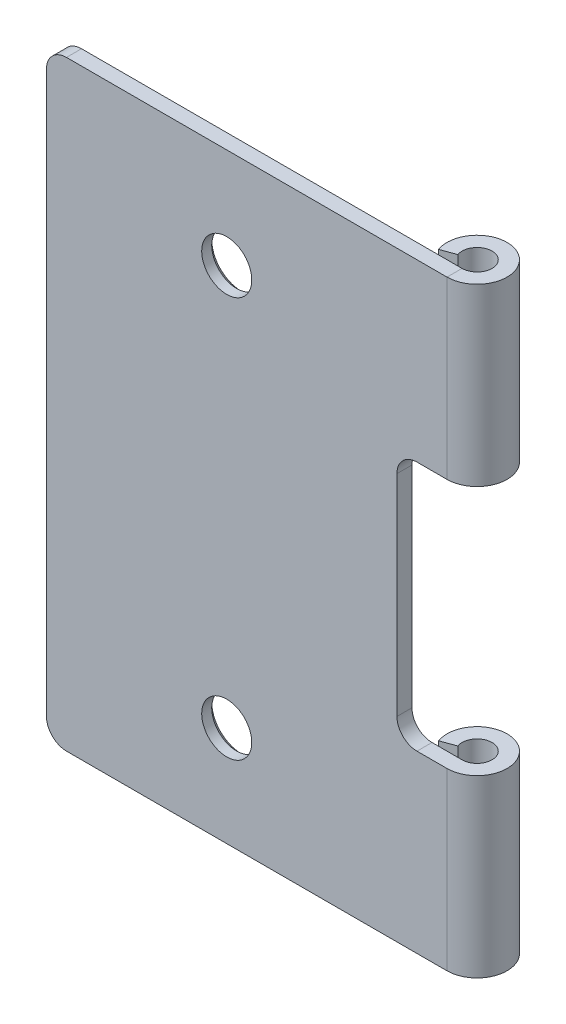
ISO-10303-21;
HEADER;
FILE_DESCRIPTION(('STEP AP214'),'2;1');
FILE_NAME('part.step','',(''),(''),'','','');
FILE_SCHEMA(('AUTOMOTIVE_DESIGN { 1 0 10303 214 1 1 1 1 }'));
ENDSEC;
DATA;
#1=APPLICATION_CONTEXT('core data for automotive mechanical design processes');
#2=APPLICATION_PROTOCOL_DEFINITION('international standard','automotive_design',2000,#1);
#3=PRODUCT_CONTEXT('',#1,'mechanical');
#4=PRODUCT('Part','Part','',(#3));
#5=PRODUCT_RELATED_PRODUCT_CATEGORY('part','',(#4));
#6=PRODUCT_DEFINITION_FORMATION('','',#4);
#7=PRODUCT_DEFINITION_CONTEXT('part definition',#1,'design');
#8=PRODUCT_DEFINITION('design','',#6,#7);
#9=PRODUCT_DEFINITION_SHAPE('','',#8);
#10=(LENGTH_UNIT() NAMED_UNIT(*) SI_UNIT(.MILLI.,.METRE.));
#11=(NAMED_UNIT(*) PLANE_ANGLE_UNIT() SI_UNIT($,.RADIAN.));
#12=(NAMED_UNIT(*) SI_UNIT($,.STERADIAN.) SOLID_ANGLE_UNIT());
#13=UNCERTAINTY_MEASURE_WITH_UNIT(LENGTH_MEASURE(1.E-05),#10,'distance_accuracy_value','');
#14=(GEOMETRIC_REPRESENTATION_CONTEXT(3) GLOBAL_UNCERTAINTY_ASSIGNED_CONTEXT((#13)) GLOBAL_UNIT_ASSIGNED_CONTEXT((#10,
#11,#12)) REPRESENTATION_CONTEXT('',''));
#15=CARTESIAN_POINT('',(0.,0.,0.));
#16=DIRECTION('',(0.,0.,1.));
#17=DIRECTION('',(1.,0.,0.));
#18=AXIS2_PLACEMENT_3D('',#15,#16,#17);
#19=CARTESIAN_POINT('',(10.3135852294402,1.25,0.15));
#20=DIRECTION('',(0.,1.,0.));
#21=DIRECTION('',(0.,0.,1.));
#22=AXIS2_PLACEMENT_3D('',#19,#20,#21);
#23=PLANE('',#22);
#24=DIRECTION('',(1.,0.,0.));
#25=VECTOR('',#24,1.);
#26=CARTESIAN_POINT('',(10.3135852294402,1.25,0.15));
#27=LINE('',#26,#25);
#28=CARTESIAN_POINT('',(9.71358522944015,1.25,0.15));
#29=VERTEX_POINT('',#28);
#30=CARTESIAN_POINT('',(10.0135852294402,1.25,0.15));
#31=VERTEX_POINT('',#30);
#32=EDGE_CURVE('E297',#29,#31,#27,.T.);
#33=ORIENTED_EDGE('',*,*,#32,.F.);
#34=DIRECTION('',(0.,0.,-1.));
#35=VECTOR('',#34,1.);
#36=CARTESIAN_POINT('',(9.71358522944015,1.25,0.));
#37=LINE('',#36,#35);
#38=CARTESIAN_POINT('',(9.71358522944015,1.25,0.));
#39=VERTEX_POINT('',#38);
#40=EDGE_CURVE('E242',#29,#39,#37,.T.);
#41=ORIENTED_EDGE('',*,*,#40,.T.);
#42=DIRECTION('',(1.,0.,0.));
#43=VECTOR('',#42,1.);
#44=CARTESIAN_POINT('',(10.0135852294402,1.25,0.));
#45=LINE('',#44,#43);
#46=CARTESIAN_POINT('',(10.0135852294402,1.25,0.));
#47=VERTEX_POINT('',#46);
#48=EDGE_CURVE('E282',#39,#47,#45,.T.);
#49=ORIENTED_EDGE('',*,*,#48,.T.);
#50=DIRECTION('',(0.,0.,1.));
#51=VECTOR('',#50,1.);
#52=CARTESIAN_POINT('',(10.0135852294402,1.25,0.));
#53=LINE('',#52,#51);
#54=EDGE_CURVE('E174',#47,#31,#53,.T.);
#55=ORIENTED_EDGE('',*,*,#54,.T.);
#56=EDGE_LOOP('',(#33,#41,#49,#55));
#57=FACE_BOUND('',#56,.T.);
#58=ADVANCED_FACE('F49',(#57),#23,.F.);
#59=CARTESIAN_POINT('',(10.0135852294402,3.,-0.15));
#60=DIRECTION('',(0.,-1.,0.));
#61=DIRECTION('',(0.,0.,-1.));
#62=AXIS2_PLACEMENT_3D('',#59,#60,#61);
#63=CYLINDRICAL_SURFACE('',#62,0.3);
#64=DIRECTION('',(0.,-1.,0.));
#65=VECTOR('',#64,1.);
#66=CARTESIAN_POINT('',(10.0135852294402,3.,0.15));
#67=LINE('',#66,#65);
#68=CARTESIAN_POINT('',(10.0135852294402,3.,0.15));
#69=VERTEX_POINT('',#68);
#70=EDGE_CURVE('E192',#69,#31,#67,.T.);
#71=ORIENTED_EDGE('',*,*,#70,.T.);
#72=CARTESIAN_POINT('',(10.0135852294402,1.25,-0.15));
#73=DIRECTION('',(0.,1.,0.));
#74=DIRECTION('',(0.,0.,1.));
#75=AXIS2_PLACEMENT_3D('',#72,#73,#74);
#76=CIRCLE('',#75,0.3);
#77=CARTESIAN_POINT('',(9.73167744320438,1.25,-0.0473939570023012));
#78=VERTEX_POINT('',#77);
#79=EDGE_CURVE('E325',#31,#78,#76,.T.);
#80=ORIENTED_EDGE('',*,*,#79,.T.);
#81=DIRECTION('',(0.,-1.,0.));
#82=VECTOR('',#81,1.);
#83=CARTESIAN_POINT('',(9.73167744320438,3.,-0.0473939570023011));
#84=LINE('',#83,#82);
#85=CARTESIAN_POINT('',(9.73167744320438,3.,-0.0473939570023011));
#86=VERTEX_POINT('',#85);
#87=EDGE_CURVE('E220',#86,#78,#84,.T.);
#88=ORIENTED_EDGE('',*,*,#87,.F.);
#89=CARTESIAN_POINT('',(10.0135852294402,3.,-0.15));
#90=DIRECTION('',(0.,1.,0.));
#91=DIRECTION('',(1.,0.,0.));
#92=AXIS2_PLACEMENT_3D('',#89,#90,#91);
#93=CIRCLE('',#92,0.3);
#94=EDGE_CURVE('E330',#69,#86,#93,.T.);
#95=ORIENTED_EDGE('',*,*,#94,.F.);
#96=EDGE_LOOP('',(#71,#80,#88,#95));
#97=FACE_BOUND('',#96,.T.);
#98=ADVANCED_FACE('F390',(#97),#63,.T.);
#99=CARTESIAN_POINT('',(9.87263133632226,3.,-0.0986969785011506));
#100=DIRECTION('',(0.342020143325664,0.,0.93969262078591));
#101=DIRECTION('',(0.93969262078591,0.,-0.342020143325664));
#102=AXIS2_PLACEMENT_3D('',#99,#100,#101);
#103=PLANE('',#102);
#104=DIRECTION('',(-0.93969262078591,0.,0.342020143325664));
#105=VECTOR('',#104,1.);
#106=CARTESIAN_POINT('',(9.87263133632226,1.25,-0.0986969785011506));
#107=LINE('',#106,#105);
#108=CARTESIAN_POINT('',(9.87263133632226,1.25,-0.0986969785011505));
#109=VERTEX_POINT('',#108);
#110=EDGE_CURVE('E322',#109,#78,#107,.T.);
#111=ORIENTED_EDGE('',*,*,#110,.F.);
#112=DIRECTION('',(0.,-1.,0.));
#113=VECTOR('',#112,1.);
#114=CARTESIAN_POINT('',(9.87263133632226,3.,-0.0986969785011506));
#115=LINE('',#114,#113);
#116=CARTESIAN_POINT('',(9.87263133632226,3.,-0.0986969785011506));
#117=VERTEX_POINT('',#116);
#118=EDGE_CURVE('E216',#117,#109,#115,.T.);
#119=ORIENTED_EDGE('',*,*,#118,.F.);
#120=DIRECTION('',(-0.93969262078591,0.,0.342020143325664));
#121=VECTOR('',#120,1.);
#122=CARTESIAN_POINT('',(9.87263133632226,3.,-0.0986969785011506));
#123=LINE('',#122,#121);
#124=EDGE_CURVE('E333',#117,#86,#123,.T.);
#125=ORIENTED_EDGE('',*,*,#124,.T.);
#126=ORIENTED_EDGE('',*,*,#87,.T.);
#127=EDGE_LOOP('',(#111,#119,#125,#126));
#128=FACE_BOUND('',#127,.T.);
#129=ADVANCED_FACE('F398',(#128),#103,.T.);
#130=CARTESIAN_POINT('',(10.0135852294402,3.,-0.15));
#131=DIRECTION('',(0.,-1.,0.));
#132=DIRECTION('',(0.,0.,-1.));
#133=AXIS2_PLACEMENT_3D('',#130,#131,#132);
#134=CYLINDRICAL_SURFACE('',#133,0.15);
#135=CARTESIAN_POINT('',(10.0135852294402,1.25,-0.15));
#136=DIRECTION('',(0.,1.,0.));
#137=DIRECTION('',(0.,0.,1.));
#138=AXIS2_PLACEMENT_3D('',#135,#136,#137);
#139=CIRCLE('',#138,0.15);
#140=EDGE_CURVE('E319',#47,#109,#139,.T.);
#141=ORIENTED_EDGE('',*,*,#140,.F.);
#142=DIRECTION('',(0.,-1.,0.));
#143=VECTOR('',#142,1.);
#144=CARTESIAN_POINT('',(10.0135852294402,3.,0.));
#145=LINE('',#144,#143);
#146=CARTESIAN_POINT('',(10.0135852294402,3.,0.));
#147=VERTEX_POINT('',#146);
#148=EDGE_CURVE('E211',#147,#47,#145,.T.);
#149=ORIENTED_EDGE('',*,*,#148,.F.);
#150=CARTESIAN_POINT('',(10.0135852294402,3.,-0.15));
#151=DIRECTION('',(0.,1.,0.));
#152=DIRECTION('',(0.,0.,1.));
#153=AXIS2_PLACEMENT_3D('',#150,#151,#152);
#154=CIRCLE('',#153,0.15);
#155=EDGE_CURVE('E337',#147,#117,#154,.T.);
#156=ORIENTED_EDGE('',*,*,#155,.T.);
#157=ORIENTED_EDGE('',*,*,#118,.T.);
#158=EDGE_LOOP('',(#141,#149,#156,#157));
#159=FACE_BOUND('',#158,.T.);
#160=ADVANCED_FACE('F415',(#159),#134,.F.);
#161=CARTESIAN_POINT('',(10.0135852294402,3.,0.15));
#162=DIRECTION('',(0.,1.,0.));
#163=DIRECTION('',(0.,0.,1.));
#164=AXIS2_PLACEMENT_3D('',#161,#162,#163);
#165=PLANE('',#164);
#166=DIRECTION('',(0.,0.,-1.));
#167=VECTOR('',#166,1.);
#168=CARTESIAN_POINT('',(10.0135852294402,3.,0.15));
#169=LINE('',#168,#167);
#170=EDGE_CURVE('E175',#69,#147,#169,.T.);
#171=ORIENTED_EDGE('',*,*,#170,.F.);
#172=ORIENTED_EDGE('',*,*,#94,.T.);
#173=ORIENTED_EDGE('',*,*,#124,.F.);
#174=ORIENTED_EDGE('',*,*,#155,.F.);
#175=EDGE_LOOP('',(#171,#172,#173,#174));
#176=FACE_BOUND('',#175,.T.);
#177=ADVANCED_FACE('F419',(#176),#165,.T.);
#178=CARTESIAN_POINT('',(10.0135852294402,-3.,0.));
#179=DIRECTION('',(0.,-1.,0.));
#180=DIRECTION('',(0.,0.,-1.));
#181=AXIS2_PLACEMENT_3D('',#178,#179,#180);
#182=PLANE('',#181);
#183=DIRECTION('',(0.,0.,1.));
#184=VECTOR('',#183,1.);
#185=CARTESIAN_POINT('',(10.0135852294402,-3.,0.));
#186=LINE('',#185,#184);
#187=CARTESIAN_POINT('',(10.0135852294402,-3.,0.));
#188=VERTEX_POINT('',#187);
#189=CARTESIAN_POINT('',(10.0135852294402,-3.,0.15));
#190=VERTEX_POINT('',#189);
#191=EDGE_CURVE('E224',#188,#190,#186,.T.);
#192=ORIENTED_EDGE('',*,*,#191,.F.);
#193=CARTESIAN_POINT('',(10.0135852294402,-3.,-0.15));
#194=DIRECTION('',(0.,1.,0.));
#195=DIRECTION('',(0.,0.,1.));
#196=AXIS2_PLACEMENT_3D('',#193,#194,#195);
#197=CIRCLE('',#196,0.15);
#198=CARTESIAN_POINT('',(9.87263133632226,-3.,-0.0986969785011506));
#199=VERTEX_POINT('',#198);
#200=EDGE_CURVE('E349',#188,#199,#197,.T.);
#201=ORIENTED_EDGE('',*,*,#200,.T.);
#202=DIRECTION('',(-0.93969262078591,0.,0.342020143325664));
#203=VECTOR('',#202,1.);
#204=CARTESIAN_POINT('',(9.87263133632226,-3.,-0.0986969785011506));
#205=LINE('',#204,#203);
#206=CARTESIAN_POINT('',(9.73167744320438,-3.,-0.0473939570023011));
#207=VERTEX_POINT('',#206);
#208=EDGE_CURVE('E345',#199,#207,#205,.T.);
#209=ORIENTED_EDGE('',*,*,#208,.T.);
#210=CARTESIAN_POINT('',(10.0135852294402,-3.,-0.15));
#211=DIRECTION('',(0.,1.,0.));
#212=DIRECTION('',(1.,0.,0.));
#213=AXIS2_PLACEMENT_3D('',#210,#211,#212);
#214=CIRCLE('',#213,0.3);
#215=EDGE_CURVE('E329',#190,#207,#214,.T.);
#216=ORIENTED_EDGE('',*,*,#215,.F.);
#217=EDGE_LOOP('',(#192,#201,#209,#216));
#218=FACE_BOUND('',#217,.T.);
#219=ADVANCED_FACE('F369',(#218),#182,.T.);
#220=CARTESIAN_POINT('',(9.73167744320438,-1.25,-0.0473939570023012));
#221=VERTEX_POINT('',#220);
#222=EDGE_CURVE('E184',#221,#207,#84,.T.);
#223=ORIENTED_EDGE('',*,*,#222,.F.);
#224=CARTESIAN_POINT('',(10.0135852294402,-1.25,-0.15));
#225=DIRECTION('',(0.,-1.,0.));
#226=DIRECTION('',(0.,0.,-1.));
#227=AXIS2_PLACEMENT_3D('',#224,#225,#226);
#228=CIRCLE('',#227,0.3);
#229=CARTESIAN_POINT('',(10.0135852294402,-1.25,0.15));
#230=VERTEX_POINT('',#229);
#231=EDGE_CURVE('E167',#221,#230,#228,.T.);
#232=ORIENTED_EDGE('',*,*,#231,.T.);
#233=EDGE_CURVE('E182',#230,#190,#67,.T.);
#234=ORIENTED_EDGE('',*,*,#233,.T.);
#235=ORIENTED_EDGE('',*,*,#215,.T.);
#236=EDGE_LOOP('',(#223,#232,#234,#235));
#237=FACE_BOUND('',#236,.T.);
#238=ADVANCED_FACE('F180',(#237),#63,.T.);
#239=DIRECTION('',(0.93969262078591,0.,-0.342020143325664));
#240=VECTOR('',#239,1.);
#241=CARTESIAN_POINT('',(9.87263133632226,-1.25,-0.0986969785011506));
#242=LINE('',#241,#240);
#243=CARTESIAN_POINT('',(9.87263133632226,-1.25,-0.0986969785011505));
#244=VERTEX_POINT('',#243);
#245=EDGE_CURVE('E187',#221,#244,#242,.T.);
#246=ORIENTED_EDGE('',*,*,#245,.F.);
#247=ORIENTED_EDGE('',*,*,#222,.T.);
#248=ORIENTED_EDGE('',*,*,#208,.F.);
#249=EDGE_CURVE('E215',#244,#199,#115,.T.);
#250=ORIENTED_EDGE('',*,*,#249,.F.);
#251=EDGE_LOOP('',(#246,#247,#248,#250));
#252=FACE_BOUND('',#251,.T.);
#253=ADVANCED_FACE('F375',(#252),#103,.T.);
#254=CARTESIAN_POINT('',(10.0135852294402,-1.25,-0.15));
#255=DIRECTION('',(0.,-1.,0.));
#256=DIRECTION('',(0.,0.,-1.));
#257=AXIS2_PLACEMENT_3D('',#254,#255,#256);
#258=CIRCLE('',#257,0.15);
#259=CARTESIAN_POINT('',(10.0135852294402,-1.25,0.));
#260=VERTEX_POINT('',#259);
#261=EDGE_CURVE('E307',#244,#260,#258,.T.);
#262=ORIENTED_EDGE('',*,*,#261,.F.);
#263=ORIENTED_EDGE('',*,*,#249,.T.);
#264=ORIENTED_EDGE('',*,*,#200,.F.);
#265=EDGE_CURVE('E210',#260,#188,#145,.T.);
#266=ORIENTED_EDGE('',*,*,#265,.F.);
#267=EDGE_LOOP('',(#262,#263,#264,#266));
#268=FACE_BOUND('',#267,.T.);
#269=ADVANCED_FACE('F370',(#268),#134,.F.);
#270=CARTESIAN_POINT('',(10.0135852294402,3.,0.));
#271=DIRECTION('',(0.,0.,-1.));
#272=DIRECTION('',(-1.,0.,0.));
#273=AXIS2_PLACEMENT_3D('',#270,#271,#272);
#274=PLANE('',#273);
#275=CARTESIAN_POINT('',(7.81358522944015,2.,0.));
#276=DIRECTION('',(0.,0.,-1.));
#277=DIRECTION('',(-1.,0.,0.));
#278=AXIS2_PLACEMENT_3D('',#275,#276,#277);
#279=CIRCLE('',#278,0.3);
#280=CARTESIAN_POINT('',(7.51358522944015,2.,0.));
#281=VERTEX_POINT('',#280);
#282=EDGE_CURVE('E648',#281,#281,#279,.T.);
#283=ORIENTED_EDGE('',*,*,#282,.F.);
#284=EDGE_LOOP('',(#283));
#285=FACE_BOUND('',#284,.T.);
#286=CARTESIAN_POINT('',(7.81358522944015,-2.,0.));
#287=DIRECTION('',(0.,0.,-1.));
#288=DIRECTION('',(-1.,0.,0.));
#289=AXIS2_PLACEMENT_3D('',#286,#287,#288);
#290=CIRCLE('',#289,0.3);
#291=CARTESIAN_POINT('',(7.51358522944015,-2.,0.));
#292=VERTEX_POINT('',#291);
#293=EDGE_CURVE('E651',#292,#292,#290,.T.);
#294=ORIENTED_EDGE('',*,*,#293,.F.);
#295=EDGE_LOOP('',(#294));
#296=FACE_BOUND('',#295,.T.);
#297=DIRECTION('',(0.,-1.,0.));
#298=VECTOR('',#297,1.);
#299=CARTESIAN_POINT('',(6.01358522944015,3.,0.));
#300=LINE('',#299,#298);
#301=CARTESIAN_POINT('',(6.01358522944015,2.8,0.));
#302=VERTEX_POINT('',#301);
#303=CARTESIAN_POINT('',(6.01358522944015,-2.8,0.));
#304=VERTEX_POINT('',#303);
#305=EDGE_CURVE('E206',#302,#304,#300,.T.);
#306=ORIENTED_EDGE('',*,*,#305,.F.);
#307=CARTESIAN_POINT('',(6.21358522944015,2.8,0.));
#308=DIRECTION('',(0.,0.,-1.));
#309=DIRECTION('',(-1.,0.,0.));
#310=AXIS2_PLACEMENT_3D('',#307,#308,#309);
#311=CIRCLE('',#310,0.2);
#312=CARTESIAN_POINT('',(6.21358522944015,3.,0.));
#313=VERTEX_POINT('',#312);
#314=EDGE_CURVE('E256',#302,#313,#311,.T.);
#315=ORIENTED_EDGE('',*,*,#314,.T.);
#316=DIRECTION('',(1.,0.,0.));
#317=VECTOR('',#316,1.);
#318=CARTESIAN_POINT('',(10.0135852294402,3.,0.));
#319=LINE('',#318,#317);
#320=EDGE_CURVE('E199',#313,#147,#319,.T.);
#321=ORIENTED_EDGE('',*,*,#320,.T.);
#322=ORIENTED_EDGE('',*,*,#148,.T.);
#323=ORIENTED_EDGE('',*,*,#48,.F.);
#324=CARTESIAN_POINT('',(9.71358522944015,1.05,0.));
#325=DIRECTION('',(0.,0.,-1.));
#326=DIRECTION('',(-1.,0.,0.));
#327=AXIS2_PLACEMENT_3D('',#324,#325,#326);
#328=CIRCLE('',#327,0.2);
#329=CARTESIAN_POINT('',(9.51358522944015,1.05,0.));
#330=VERTEX_POINT('',#329);
#331=EDGE_CURVE('E58',#39,#330,#328,.F.);
#332=ORIENTED_EDGE('',*,*,#331,.T.);
#333=DIRECTION('',(0.,1.,0.));
#334=VECTOR('',#333,1.);
#335=CARTESIAN_POINT('',(9.51358522944015,3.,0.));
#336=LINE('',#335,#334);
#337=CARTESIAN_POINT('',(9.51358522944015,-1.05,0.));
#338=VERTEX_POINT('',#337);
#339=EDGE_CURVE('E186',#338,#330,#336,.T.);
#340=ORIENTED_EDGE('',*,*,#339,.F.);
#341=CARTESIAN_POINT('',(9.71358522944015,-1.05,0.));
#342=DIRECTION('',(0.,0.,-1.));
#343=DIRECTION('',(-1.,0.,0.));
#344=AXIS2_PLACEMENT_3D('',#341,#342,#343);
#345=CIRCLE('',#344,0.2);
#346=CARTESIAN_POINT('',(9.71358522944015,-1.25,0.));
#347=VERTEX_POINT('',#346);
#348=EDGE_CURVE('E270',#338,#347,#345,.F.);
#349=ORIENTED_EDGE('',*,*,#348,.T.);
#350=DIRECTION('',(-1.,0.,0.));
#351=VECTOR('',#350,1.);
#352=CARTESIAN_POINT('',(10.0135852294402,-1.25,0.));
#353=LINE('',#352,#351);
#354=EDGE_CURVE('E303',#260,#347,#353,.T.);
#355=ORIENTED_EDGE('',*,*,#354,.F.);
#356=ORIENTED_EDGE('',*,*,#265,.T.);
#357=DIRECTION('',(1.,0.,0.));
#358=VECTOR('',#357,1.);
#359=CARTESIAN_POINT('',(10.0135852294402,-3.,0.));
#360=LINE('',#359,#358);
#361=CARTESIAN_POINT('',(6.21358522944015,-3.,0.));
#362=VERTEX_POINT('',#361);
#363=EDGE_CURVE('E352',#362,#188,#360,.T.);
#364=ORIENTED_EDGE('',*,*,#363,.F.);
#365=CARTESIAN_POINT('',(6.21358522944015,-2.8,0.));
#366=DIRECTION('',(0.,0.,-1.));
#367=DIRECTION('',(-1.,0.,0.));
#368=AXIS2_PLACEMENT_3D('',#365,#366,#367);
#369=CIRCLE('',#368,0.2);
#370=EDGE_CURVE('E253',#362,#304,#369,.T.);
#371=ORIENTED_EDGE('',*,*,#370,.T.);
#372=EDGE_LOOP('',(#306,#315,#321,#322,#323,#332,#340,#349,#355,#356,#364,#371));
#373=FACE_BOUND('',#372,.T.);
#374=ADVANCED_FACE('F281',(#285,#296,#373),#274,.T.);
#375=CARTESIAN_POINT('',(6.01358522944015,3.,0.15));
#376=DIRECTION('',(-1.,0.,0.));
#377=DIRECTION('',(0.,0.,1.));
#378=AXIS2_PLACEMENT_3D('',#375,#376,#377);
#379=PLANE('',#378);
#380=DIRECTION('',(0.,-1.,0.));
#381=VECTOR('',#380,1.);
#382=CARTESIAN_POINT('',(6.01358522944015,3.,0.15));
#383=LINE('',#382,#381);
#384=CARTESIAN_POINT('',(6.01358522944015,2.8,0.15));
#385=VERTEX_POINT('',#384);
#386=CARTESIAN_POINT('',(6.01358522944015,-2.8,0.15));
#387=VERTEX_POINT('',#386);
#388=EDGE_CURVE('E198',#385,#387,#383,.T.);
#389=ORIENTED_EDGE('',*,*,#388,.F.);
#390=DIRECTION('',(0.,0.,-1.));
#391=VECTOR('',#390,1.);
#392=CARTESIAN_POINT('',(6.01358522944015,2.8,0.15));
#393=LINE('',#392,#391);
#394=EDGE_CURVE('E249',#385,#302,#393,.T.);
#395=ORIENTED_EDGE('',*,*,#394,.T.);
#396=ORIENTED_EDGE('',*,*,#305,.T.);
#397=DIRECTION('',(0.,0.,-1.));
#398=VECTOR('',#397,1.);
#399=CARTESIAN_POINT('',(6.01358522944015,-2.8,0.15));
#400=LINE('',#399,#398);
#401=EDGE_CURVE('E246',#304,#387,#400,.F.);
#402=ORIENTED_EDGE('',*,*,#401,.T.);
#403=EDGE_LOOP('',(#389,#395,#396,#402));
#404=FACE_BOUND('',#403,.T.);
#405=ADVANCED_FACE('F545',(#404),#379,.T.);
#406=CARTESIAN_POINT('',(10.0135852294402,3.,0.15));
#407=DIRECTION('',(0.,0.,-1.));
#408=DIRECTION('',(-1.,0.,0.));
#409=AXIS2_PLACEMENT_3D('',#406,#407,#408);
#410=PLANE('',#409);
#411=CARTESIAN_POINT('',(7.81358522944015,2.,0.15));
#412=DIRECTION('',(0.,0.,-1.));
#413=DIRECTION('',(-1.,0.,0.));
#414=AXIS2_PLACEMENT_3D('',#411,#412,#413);
#415=CIRCLE('',#414,0.25);
#416=CARTESIAN_POINT('',(7.56358522944015,2.,0.15));
#417=VERTEX_POINT('',#416);
#418=EDGE_CURVE('E655',#417,#417,#415,.T.);
#419=ORIENTED_EDGE('',*,*,#418,.T.);
#420=EDGE_LOOP('',(#419));
#421=FACE_BOUND('',#420,.T.);
#422=CARTESIAN_POINT('',(7.81358522944015,-2.,0.15));
#423=DIRECTION('',(0.,0.,-1.));
#424=DIRECTION('',(-1.,0.,0.));
#425=AXIS2_PLACEMENT_3D('',#422,#423,#424);
#426=CIRCLE('',#425,0.25);
#427=CARTESIAN_POINT('',(7.56358522944015,-2.,0.15));
#428=VERTEX_POINT('',#427);
#429=EDGE_CURVE('E309',#428,#428,#426,.T.);
#430=ORIENTED_EDGE('',*,*,#429,.T.);
#431=EDGE_LOOP('',(#430));
#432=FACE_BOUND('',#431,.T.);
#433=DIRECTION('',(1.,0.,0.));
#434=VECTOR('',#433,1.);
#435=CARTESIAN_POINT('',(10.0135852294402,3.,0.15));
#436=LINE('',#435,#434);
#437=CARTESIAN_POINT('',(6.21358522944015,3.,0.15));
#438=VERTEX_POINT('',#437);
#439=EDGE_CURVE('E193',#438,#69,#436,.T.);
#440=ORIENTED_EDGE('',*,*,#439,.F.);
#441=CARTESIAN_POINT('',(6.21358522944015,2.8,0.15));
#442=DIRECTION('',(0.,0.,-1.));
#443=DIRECTION('',(-1.,0.,0.));
#444=AXIS2_PLACEMENT_3D('',#441,#442,#443);
#445=CIRCLE('',#444,0.2);
#446=EDGE_CURVE('E263',#438,#385,#445,.F.);
#447=ORIENTED_EDGE('',*,*,#446,.T.);
#448=ORIENTED_EDGE('',*,*,#388,.T.);
#449=CARTESIAN_POINT('',(6.21358522944015,-2.8,0.15));
#450=DIRECTION('',(0.,0.,-1.));
#451=DIRECTION('',(-1.,0.,0.));
#452=AXIS2_PLACEMENT_3D('',#449,#450,#451);
#453=CIRCLE('',#452,0.2);
#454=CARTESIAN_POINT('',(6.21358522944015,-3.,0.15));
#455=VERTEX_POINT('',#454);
#456=EDGE_CURVE('E65',#387,#455,#453,.F.);
#457=ORIENTED_EDGE('',*,*,#456,.T.);
#458=DIRECTION('',(1.,0.,0.));
#459=VECTOR('',#458,1.);
#460=CARTESIAN_POINT('',(10.0135852294402,-3.,0.15));
#461=LINE('',#460,#459);
#462=EDGE_CURVE('E190',#455,#190,#461,.T.);
#463=ORIENTED_EDGE('',*,*,#462,.T.);
#464=ORIENTED_EDGE('',*,*,#233,.F.);
#465=DIRECTION('',(-1.,0.,0.));
#466=VECTOR('',#465,1.);
#467=CARTESIAN_POINT('',(10.0135852294402,-1.25,0.15));
#468=LINE('',#467,#466);
#469=CARTESIAN_POINT('',(9.71358522944015,-1.25,0.15));
#470=VERTEX_POINT('',#469);
#471=EDGE_CURVE('E163',#230,#470,#468,.T.);
#472=ORIENTED_EDGE('',*,*,#471,.T.);
#473=CARTESIAN_POINT('',(9.71358522944015,-1.05,0.15));
#474=DIRECTION('',(0.,0.,-1.));
#475=DIRECTION('',(-1.,0.,0.));
#476=AXIS2_PLACEMENT_3D('',#473,#474,#475);
#477=CIRCLE('',#476,0.2);
#478=CARTESIAN_POINT('',(9.51358522944015,-1.05,0.15));
#479=VERTEX_POINT('',#478);
#480=EDGE_CURVE('E273',#470,#479,#477,.T.);
#481=ORIENTED_EDGE('',*,*,#480,.T.);
#482=DIRECTION('',(0.,1.,0.));
#483=VECTOR('',#482,1.);
#484=CARTESIAN_POINT('',(9.51358522944015,1.25,0.15));
#485=LINE('',#484,#483);
#486=CARTESIAN_POINT('',(9.51358522944015,1.05,0.15));
#487=VERTEX_POINT('',#486);
#488=EDGE_CURVE('E298',#479,#487,#485,.T.);
#489=ORIENTED_EDGE('',*,*,#488,.T.);
#490=CARTESIAN_POINT('',(9.71358522944015,1.05,0.15));
#491=DIRECTION('',(0.,0.,-1.));
#492=DIRECTION('',(-1.,0.,0.));
#493=AXIS2_PLACEMENT_3D('',#490,#491,#492);
#494=CIRCLE('',#493,0.2);
#495=EDGE_CURVE('E12',#487,#29,#494,.T.);
#496=ORIENTED_EDGE('',*,*,#495,.T.);
#497=ORIENTED_EDGE('',*,*,#32,.T.);
#498=ORIENTED_EDGE('',*,*,#70,.F.);
#499=EDGE_LOOP('',(#440,#447,#448,#457,#463,#464,#472,#481,#489,#496,#497,#498));
#500=FACE_BOUND('',#499,.T.);
#501=ADVANCED_FACE('F189',(#421,#432,#500),#410,.F.);
#502=CARTESIAN_POINT('',(10.0135852294402,3.,-0.15));
#503=DIRECTION('',(0.,1.,0.));
#504=DIRECTION('',(1.,0.,0.));
#505=AXIS2_PLACEMENT_3D('',#502,#503,#504);
#506=PLANE('',#505);
#507=ORIENTED_EDGE('',*,*,#320,.F.);
#508=DIRECTION('',(0.,0.,-1.));
#509=VECTOR('',#508,1.);
#510=CARTESIAN_POINT('',(6.21358522944015,3.,-0.15));
#511=LINE('',#510,#509);
#512=EDGE_CURVE('E73',#313,#438,#511,.F.);
#513=ORIENTED_EDGE('',*,*,#512,.T.);
#514=ORIENTED_EDGE('',*,*,#439,.T.);
#515=ORIENTED_EDGE('',*,*,#170,.T.);
#516=EDGE_LOOP('',(#507,#513,#514,#515));
#517=FACE_BOUND('',#516,.T.);
#518=ADVANCED_FACE('F409',(#517),#506,.T.);
#519=CARTESIAN_POINT('',(10.0135852294402,-3.,-0.15));
#520=DIRECTION('',(0.,1.,0.));
#521=DIRECTION('',(1.,0.,0.));
#522=AXIS2_PLACEMENT_3D('',#519,#520,#521);
#523=PLANE('',#522);
#524=ORIENTED_EDGE('',*,*,#462,.F.);
#525=DIRECTION('',(0.,0.,-1.));
#526=VECTOR('',#525,1.);
#527=CARTESIAN_POINT('',(6.21358522944015,-3.,0.));
#528=LINE('',#527,#526);
#529=EDGE_CURVE('E266',#455,#362,#528,.T.);
#530=ORIENTED_EDGE('',*,*,#529,.T.);
#531=ORIENTED_EDGE('',*,*,#363,.T.);
#532=ORIENTED_EDGE('',*,*,#191,.T.);
#533=EDGE_LOOP('',(#524,#530,#531,#532));
#534=FACE_BOUND('',#533,.T.);
#535=ADVANCED_FACE('F358',(#534),#523,.F.);
#536=ORIENTED_EDGE('',*,*,#54,.F.);
#537=ORIENTED_EDGE('',*,*,#140,.T.);
#538=ORIENTED_EDGE('',*,*,#110,.T.);
#539=ORIENTED_EDGE('',*,*,#79,.F.);
#540=EDGE_LOOP('',(#536,#537,#538,#539));
#541=FACE_BOUND('',#540,.T.);
#542=ADVANCED_FACE('F392',(#541),#23,.F.);
#543=CARTESIAN_POINT('',(10.3135852294402,-1.25,0.15));
#544=DIRECTION('',(0.,-1.,0.));
#545=DIRECTION('',(0.,0.,-1.));
#546=AXIS2_PLACEMENT_3D('',#543,#544,#545);
#547=PLANE('',#546);
#548=ORIENTED_EDGE('',*,*,#354,.T.);
#549=DIRECTION('',(0.,0.,-1.));
#550=VECTOR('',#549,1.);
#551=CARTESIAN_POINT('',(9.71358522944015,-1.25,0.15));
#552=LINE('',#551,#550);
#553=EDGE_CURVE('E170',#347,#470,#552,.F.);
#554=ORIENTED_EDGE('',*,*,#553,.T.);
#555=ORIENTED_EDGE('',*,*,#471,.F.);
#556=ORIENTED_EDGE('',*,*,#231,.F.);
#557=ORIENTED_EDGE('',*,*,#245,.T.);
#558=ORIENTED_EDGE('',*,*,#261,.T.);
#559=EDGE_LOOP('',(#548,#554,#555,#556,#557,#558));
#560=FACE_BOUND('',#559,.T.);
#561=ADVANCED_FACE('F166',(#560),#547,.F.);
#562=CARTESIAN_POINT('',(9.51358522944015,1.25,0.15));
#563=DIRECTION('',(-1.,0.,0.));
#564=DIRECTION('',(0.,0.,1.));
#565=AXIS2_PLACEMENT_3D('',#562,#563,#564);
#566=PLANE('',#565);
#567=ORIENTED_EDGE('',*,*,#488,.F.);
#568=DIRECTION('',(0.,0.,-1.));
#569=VECTOR('',#568,1.);
#570=CARTESIAN_POINT('',(9.51358522944015,-1.05,0.));
#571=LINE('',#570,#569);
#572=EDGE_CURVE('E236',#479,#338,#571,.T.);
#573=ORIENTED_EDGE('',*,*,#572,.T.);
#574=ORIENTED_EDGE('',*,*,#339,.T.);
#575=DIRECTION('',(0.,0.,-1.));
#576=VECTOR('',#575,1.);
#577=CARTESIAN_POINT('',(9.51358522944015,1.05,0.15));
#578=LINE('',#577,#576);
#579=EDGE_CURVE('E233',#330,#487,#578,.F.);
#580=ORIENTED_EDGE('',*,*,#579,.T.);
#581=EDGE_LOOP('',(#567,#573,#574,#580));
#582=FACE_BOUND('',#581,.T.);
#583=ADVANCED_FACE('F288',(#582),#566,.F.);
#584=CARTESIAN_POINT('',(9.71358522944015,-1.05,0.15));
#585=DIRECTION('',(0.,0.,1.));
#586=DIRECTION('',(1.,0.,0.));
#587=AXIS2_PLACEMENT_3D('',#584,#585,#586);
#588=CYLINDRICAL_SURFACE('',#587,0.2);
#589=ORIENTED_EDGE('',*,*,#480,.F.);
#590=ORIENTED_EDGE('',*,*,#553,.F.);
#591=ORIENTED_EDGE('',*,*,#348,.F.);
#592=ORIENTED_EDGE('',*,*,#572,.F.);
#593=EDGE_LOOP('',(#589,#590,#591,#592));
#594=FACE_BOUND('',#593,.T.);
#595=ADVANCED_FACE('F378',(#594),#588,.F.);
#596=CARTESIAN_POINT('',(9.71358522944015,1.05,0.15));
#597=DIRECTION('',(0.,0.,1.));
#598=DIRECTION('',(1.,0.,0.));
#599=AXIS2_PLACEMENT_3D('',#596,#597,#598);
#600=CYLINDRICAL_SURFACE('',#599,0.2);
#601=ORIENTED_EDGE('',*,*,#495,.F.);
#602=ORIENTED_EDGE('',*,*,#579,.F.);
#603=ORIENTED_EDGE('',*,*,#331,.F.);
#604=ORIENTED_EDGE('',*,*,#40,.F.);
#605=EDGE_LOOP('',(#601,#602,#603,#604));
#606=FACE_BOUND('',#605,.T.);
#607=ADVANCED_FACE('F294',(#606),#600,.F.);
#608=CARTESIAN_POINT('',(6.21358522944015,2.8,0.15));
#609=DIRECTION('',(0.,0.,-1.));
#610=DIRECTION('',(-1.,0.,0.));
#611=AXIS2_PLACEMENT_3D('',#608,#609,#610);
#612=CYLINDRICAL_SURFACE('',#611,0.2);
#613=ORIENTED_EDGE('',*,*,#446,.F.);
#614=ORIENTED_EDGE('',*,*,#512,.F.);
#615=ORIENTED_EDGE('',*,*,#314,.F.);
#616=ORIENTED_EDGE('',*,*,#394,.F.);
#617=EDGE_LOOP('',(#613,#614,#615,#616));
#618=FACE_BOUND('',#617,.T.);
#619=ADVANCED_FACE('F385',(#618),#612,.T.);
#620=CARTESIAN_POINT('',(6.21358522944015,-2.8,-0.15));
#621=DIRECTION('',(0.,0.,1.));
#622=DIRECTION('',(1.,0.,0.));
#623=AXIS2_PLACEMENT_3D('',#620,#621,#622);
#624=CYLINDRICAL_SURFACE('',#623,0.2);
#625=ORIENTED_EDGE('',*,*,#456,.F.);
#626=ORIENTED_EDGE('',*,*,#401,.F.);
#627=ORIENTED_EDGE('',*,*,#370,.F.);
#628=ORIENTED_EDGE('',*,*,#529,.F.);
#629=EDGE_LOOP('',(#625,#626,#627,#628));
#630=FACE_BOUND('',#629,.T.);
#631=ADVANCED_FACE('F51',(#630),#624,.T.);
#632=CARTESIAN_POINT('',(7.81358522944015,-2.,0.));
#633=DIRECTION('',(0.,0.,-1.));
#634=DIRECTION('',(-1.,0.,0.));
#635=AXIS2_PLACEMENT_3D('',#632,#633,#634);
#636=CYLINDRICAL_SURFACE('',#635,0.25);
#637=ORIENTED_EDGE('',*,*,#429,.F.);
#638=EDGE_LOOP('',(#637));
#639=FACE_BOUND('',#638,.T.);
#640=CARTESIAN_POINT('',(7.81358522944015,-2.,0.0500000000000001));
#641=DIRECTION('',(0.,0.,-1.));
#642=DIRECTION('',(-1.,0.,0.));
#643=AXIS2_PLACEMENT_3D('',#640,#641,#642);
#644=CIRCLE('',#643,0.25);
#645=CARTESIAN_POINT('',(7.56358522944015,-2.,0.0500000000000001));
#646=VERTEX_POINT('',#645);
#647=EDGE_CURVE('E654',#646,#646,#644,.T.);
#648=ORIENTED_EDGE('',*,*,#647,.T.);
#649=EDGE_LOOP('',(#648));
#650=FACE_BOUND('',#649,.T.);
#651=ADVANCED_FACE('F500',(#639,#650),#636,.F.);
#652=CARTESIAN_POINT('',(7.81358522944015,-2.,0.));
#653=DIRECTION('',(0.,0.,-1.));
#654=DIRECTION('',(-1.,0.,0.));
#655=AXIS2_PLACEMENT_3D('',#652,#653,#654);
#656=CONICAL_SURFACE('',#655,0.3,0.785398163397445);
#657=ORIENTED_EDGE('',*,*,#647,.F.);
#658=EDGE_LOOP('',(#657));
#659=FACE_BOUND('',#658,.T.);
#660=ORIENTED_EDGE('',*,*,#293,.T.);
#661=EDGE_LOOP('',(#660));
#662=FACE_BOUND('',#661,.T.);
#663=ADVANCED_FACE('F508',(#659,#662),#656,.F.);
#664=CARTESIAN_POINT('',(7.81358522944015,2.,0.));
#665=DIRECTION('',(0.,0.,-1.));
#666=DIRECTION('',(-1.,0.,0.));
#667=AXIS2_PLACEMENT_3D('',#664,#665,#666);
#668=CYLINDRICAL_SURFACE('',#667,0.25);
#669=ORIENTED_EDGE('',*,*,#418,.F.);
#670=EDGE_LOOP('',(#669));
#671=FACE_BOUND('',#670,.T.);
#672=CARTESIAN_POINT('',(7.81358522944015,2.,0.0500000000000001));
#673=DIRECTION('',(0.,0.,-1.));
#674=DIRECTION('',(-1.,0.,0.));
#675=AXIS2_PLACEMENT_3D('',#672,#673,#674);
#676=CIRCLE('',#675,0.25);
#677=CARTESIAN_POINT('',(7.56358522944015,2.,0.0500000000000001));
#678=VERTEX_POINT('',#677);
#679=EDGE_CURVE('E662',#678,#678,#676,.T.);
#680=ORIENTED_EDGE('',*,*,#679,.T.);
#681=EDGE_LOOP('',(#680));
#682=FACE_BOUND('',#681,.T.);
#683=ADVANCED_FACE('F516',(#671,#682),#668,.F.);
#684=CARTESIAN_POINT('',(7.81358522944015,2.,0.));
#685=DIRECTION('',(0.,0.,-1.));
#686=DIRECTION('',(-1.,0.,0.));
#687=AXIS2_PLACEMENT_3D('',#684,#685,#686);
#688=CONICAL_SURFACE('',#687,0.3,0.785398163397445);
#689=ORIENTED_EDGE('',*,*,#679,.F.);
#690=EDGE_LOOP('',(#689));
#691=FACE_BOUND('',#690,.T.);
#692=ORIENTED_EDGE('',*,*,#282,.T.);
#693=EDGE_LOOP('',(#692));
#694=FACE_BOUND('',#693,.T.);
#695=ADVANCED_FACE('F525',(#691,#694),#688,.F.);
#696=CLOSED_SHELL('',(#58,#98,#129,#160,#177,#219,#238,#253,#269,#374,#405,#501,#518,#535,#542,
#561,#583,#595,#607,#619,#631,#651,#663,#683,#695));
#697=MANIFOLD_SOLID_BREP('B2',#696);
#698=ADVANCED_BREP_SHAPE_REPRESENTATION('',(#18,#697),#14);
#699=SHAPE_DEFINITION_REPRESENTATION(#9,#698);
ENDSEC;
END-ISO-10303-21;
